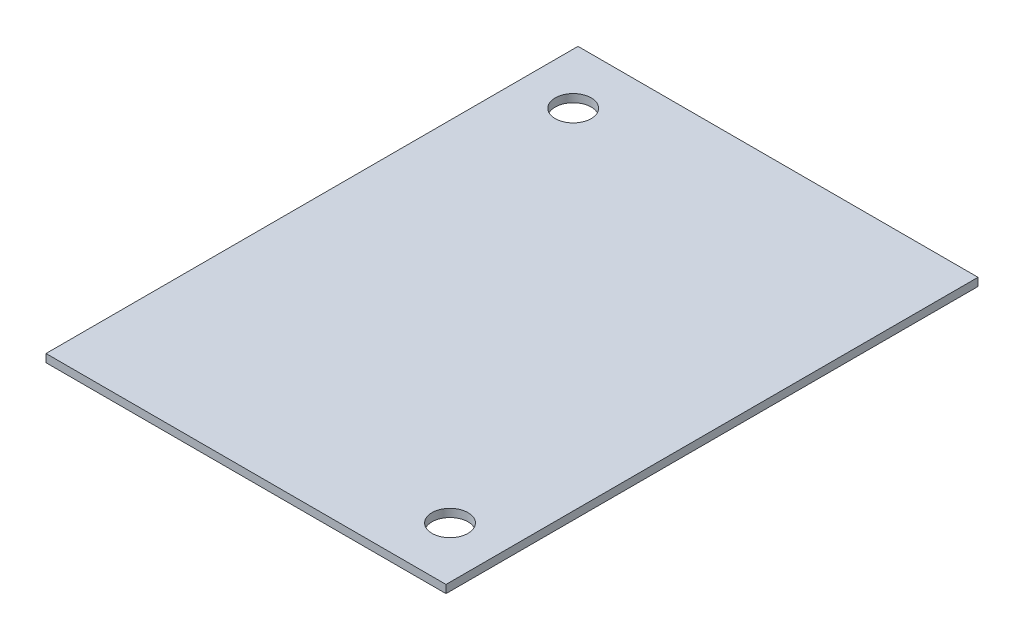
ISO-10303-21;
HEADER;
FILE_DESCRIPTION(('STEP AP214'),'2;1');
FILE_NAME('part.step','',(''),(''),'','','');
FILE_SCHEMA(('AUTOMOTIVE_DESIGN { 1 0 10303 214 1 1 1 1 }'));
ENDSEC;
DATA;
#1=APPLICATION_CONTEXT('core data for automotive mechanical design processes');
#2=APPLICATION_PROTOCOL_DEFINITION('international standard','automotive_design',2000,#1);
#3=PRODUCT_CONTEXT('',#1,'mechanical');
#4=PRODUCT('Part','Part','',(#3));
#5=PRODUCT_RELATED_PRODUCT_CATEGORY('part','',(#4));
#6=PRODUCT_DEFINITION_FORMATION('','',#4);
#7=PRODUCT_DEFINITION_CONTEXT('part definition',#1,'design');
#8=PRODUCT_DEFINITION('design','',#6,#7);
#9=PRODUCT_DEFINITION_SHAPE('','',#8);
#10=(LENGTH_UNIT() NAMED_UNIT(*) SI_UNIT(.MILLI.,.METRE.));
#11=(NAMED_UNIT(*) PLANE_ANGLE_UNIT() SI_UNIT($,.RADIAN.));
#12=(NAMED_UNIT(*) SI_UNIT($,.STERADIAN.) SOLID_ANGLE_UNIT());
#13=UNCERTAINTY_MEASURE_WITH_UNIT(LENGTH_MEASURE(1.E-05),#10,'distance_accuracy_value','');
#14=(GEOMETRIC_REPRESENTATION_CONTEXT(3) GLOBAL_UNCERTAINTY_ASSIGNED_CONTEXT((#13)) GLOBAL_UNIT_ASSIGNED_CONTEXT((#10,
#11,#12)) REPRESENTATION_CONTEXT('',''));
#15=CARTESIAN_POINT('',(0.,0.,0.));
#16=DIRECTION('',(0.,0.,1.));
#17=DIRECTION('',(1.,0.,0.));
#18=AXIS2_PLACEMENT_3D('',#15,#16,#17);
#19=CARTESIAN_POINT('',(0.,1.,0.));
#20=DIRECTION('',(0.,1.,0.));
#21=DIRECTION('',(0.,0.,1.));
#22=AXIS2_PLACEMENT_3D('',#19,#20,#21);
#23=PLANE('',#22);
#24=CARTESIAN_POINT('',(-18.6,1.,-26.25));
#25=DIRECTION('',(0.,1.,0.));
#26=DIRECTION('',(0.,0.,1.));
#27=AXIS2_PLACEMENT_3D('',#24,#25,#26);
#28=CIRCLE('',#27,2.25);
#29=CARTESIAN_POINT('',(-18.6,1.,-24.));
#30=VERTEX_POINT('',#29);
#31=EDGE_CURVE('E107',#30,#30,#28,.T.);
#32=ORIENTED_EDGE('',*,*,#31,.F.);
#33=EDGE_LOOP('',(#32));
#34=FACE_BOUND('',#33,.T.);
#35=DIRECTION('',(0.,0.,-1.));
#36=VECTOR('',#35,1.);
#37=CARTESIAN_POINT('',(25.,1.,-33.25));
#38=LINE('',#37,#36);
#39=CARTESIAN_POINT('',(25.,1.,33.25));
#40=VERTEX_POINT('',#39);
#41=CARTESIAN_POINT('',(25.,1.,-33.25));
#42=VERTEX_POINT('',#41);
#43=EDGE_CURVE('E92',#40,#42,#38,.T.);
#44=ORIENTED_EDGE('',*,*,#43,.T.);
#45=DIRECTION('',(-1.,0.,0.));
#46=VECTOR('',#45,1.);
#47=CARTESIAN_POINT('',(-25.,1.,-33.25));
#48=LINE('',#47,#46);
#49=CARTESIAN_POINT('',(-25.,1.,-33.25));
#50=VERTEX_POINT('',#49);
#51=EDGE_CURVE('E87',#42,#50,#48,.T.);
#52=ORIENTED_EDGE('',*,*,#51,.T.);
#53=DIRECTION('',(0.,0.,1.));
#54=VECTOR('',#53,1.);
#55=CARTESIAN_POINT('',(-25.,1.,-33.25));
#56=LINE('',#55,#54);
#57=CARTESIAN_POINT('',(-25.,1.,33.25));
#58=VERTEX_POINT('',#57);
#59=EDGE_CURVE('E90',#50,#58,#56,.T.);
#60=ORIENTED_EDGE('',*,*,#59,.T.);
#61=DIRECTION('',(1.,0.,0.));
#62=VECTOR('',#61,1.);
#63=CARTESIAN_POINT('',(-25.,1.,33.25));
#64=LINE('',#63,#62);
#65=EDGE_CURVE('E57',#58,#40,#64,.T.);
#66=ORIENTED_EDGE('',*,*,#65,.T.);
#67=EDGE_LOOP('',(#44,#52,#60,#66));
#68=FACE_BOUND('',#67,.T.);
#69=CARTESIAN_POINT('',(18.6,1.,26.35));
#70=DIRECTION('',(0.,1.,0.));
#71=DIRECTION('',(0.,0.,1.));
#72=AXIS2_PLACEMENT_3D('',#69,#70,#71);
#73=CIRCLE('',#72,2.25);
#74=CARTESIAN_POINT('',(18.6,1.,28.6));
#75=VERTEX_POINT('',#74);
#76=EDGE_CURVE('E122',#75,#75,#73,.T.);
#77=ORIENTED_EDGE('',*,*,#76,.F.);
#78=EDGE_LOOP('',(#77));
#79=FACE_BOUND('',#78,.T.);
#80=ADVANCED_FACE('F40',(#34,#68,#79),#23,.T.);
#81=CARTESIAN_POINT('',(0.,0.,0.));
#82=DIRECTION('',(0.,1.,0.));
#83=DIRECTION('',(0.,0.,1.));
#84=AXIS2_PLACEMENT_3D('',#81,#82,#83);
#85=PLANE('',#84);
#86=DIRECTION('',(0.,0.,-1.));
#87=VECTOR('',#86,1.);
#88=CARTESIAN_POINT('',(25.,0.,-33.25));
#89=LINE('',#88,#87);
#90=CARTESIAN_POINT('',(25.,0.,33.25));
#91=VERTEX_POINT('',#90);
#92=CARTESIAN_POINT('',(25.,0.,-33.25));
#93=VERTEX_POINT('',#92);
#94=EDGE_CURVE('E104',#91,#93,#89,.T.);
#95=ORIENTED_EDGE('',*,*,#94,.F.);
#96=DIRECTION('',(1.,0.,0.));
#97=VECTOR('',#96,1.);
#98=CARTESIAN_POINT('',(-25.,0.,33.25));
#99=LINE('',#98,#97);
#100=CARTESIAN_POINT('',(-25.,0.,33.25));
#101=VERTEX_POINT('',#100);
#102=EDGE_CURVE('E80',#101,#91,#99,.T.);
#103=ORIENTED_EDGE('',*,*,#102,.F.);
#104=DIRECTION('',(0.,0.,1.));
#105=VECTOR('',#104,1.);
#106=CARTESIAN_POINT('',(-25.,0.,-33.25));
#107=LINE('',#106,#105);
#108=CARTESIAN_POINT('',(-25.,0.,-33.25));
#109=VERTEX_POINT('',#108);
#110=EDGE_CURVE('E74',#109,#101,#107,.T.);
#111=ORIENTED_EDGE('',*,*,#110,.F.);
#112=DIRECTION('',(-1.,0.,0.));
#113=VECTOR('',#112,1.);
#114=CARTESIAN_POINT('',(-25.,0.,-33.25));
#115=LINE('',#114,#113);
#116=EDGE_CURVE('E96',#93,#109,#115,.T.);
#117=ORIENTED_EDGE('',*,*,#116,.F.);
#118=EDGE_LOOP('',(#95,#103,#111,#117));
#119=FACE_BOUND('',#118,.T.);
#120=CARTESIAN_POINT('',(-18.6,0.,-26.25));
#121=DIRECTION('',(0.,1.,0.));
#122=DIRECTION('',(0.,0.,1.));
#123=AXIS2_PLACEMENT_3D('',#120,#121,#122);
#124=CIRCLE('',#123,2.25);
#125=CARTESIAN_POINT('',(-18.6,0.,-24.));
#126=VERTEX_POINT('',#125);
#127=EDGE_CURVE('E119',#126,#126,#124,.T.);
#128=ORIENTED_EDGE('',*,*,#127,.T.);
#129=EDGE_LOOP('',(#128));
#130=FACE_BOUND('',#129,.T.);
#131=CARTESIAN_POINT('',(18.6,0.,26.35));
#132=DIRECTION('',(0.,1.,0.));
#133=DIRECTION('',(0.,0.,1.));
#134=AXIS2_PLACEMENT_3D('',#131,#132,#133);
#135=CIRCLE('',#134,2.25);
#136=CARTESIAN_POINT('',(18.6,0.,28.6));
#137=VERTEX_POINT('',#136);
#138=EDGE_CURVE('E125',#137,#137,#135,.T.);
#139=ORIENTED_EDGE('',*,*,#138,.T.);
#140=EDGE_LOOP('',(#139));
#141=FACE_BOUND('',#140,.T.);
#142=ADVANCED_FACE('F115',(#119,#130,#141),#85,.F.);
#143=CARTESIAN_POINT('',(25.,1.,-33.25));
#144=DIRECTION('',(-1.,0.,0.));
#145=DIRECTION('',(0.,0.,1.));
#146=AXIS2_PLACEMENT_3D('',#143,#144,#145);
#147=PLANE('',#146);
#148=ORIENTED_EDGE('',*,*,#94,.T.);
#149=DIRECTION('',(0.,-1.,0.));
#150=VECTOR('',#149,1.);
#151=CARTESIAN_POINT('',(25.,1.,-33.25));
#152=LINE('',#151,#150);
#153=EDGE_CURVE('E11',#42,#93,#152,.T.);
#154=ORIENTED_EDGE('',*,*,#153,.F.);
#155=ORIENTED_EDGE('',*,*,#43,.F.);
#156=DIRECTION('',(0.,-1.,0.));
#157=VECTOR('',#156,1.);
#158=CARTESIAN_POINT('',(25.,1.,33.25));
#159=LINE('',#158,#157);
#160=EDGE_CURVE('E100',#40,#91,#159,.T.);
#161=ORIENTED_EDGE('',*,*,#160,.T.);
#162=EDGE_LOOP('',(#148,#154,#155,#161));
#163=FACE_BOUND('',#162,.T.);
#164=ADVANCED_FACE('F42',(#163),#147,.F.);
#165=CARTESIAN_POINT('',(-25.,1.,-33.25));
#166=DIRECTION('',(0.,0.,1.));
#167=DIRECTION('',(1.,0.,0.));
#168=AXIS2_PLACEMENT_3D('',#165,#166,#167);
#169=PLANE('',#168);
#170=ORIENTED_EDGE('',*,*,#116,.T.);
#171=DIRECTION('',(0.,-1.,0.));
#172=VECTOR('',#171,1.);
#173=CARTESIAN_POINT('',(-25.,1.,-33.25));
#174=LINE('',#173,#172);
#175=EDGE_CURVE('E49',#50,#109,#174,.T.);
#176=ORIENTED_EDGE('',*,*,#175,.F.);
#177=ORIENTED_EDGE('',*,*,#51,.F.);
#178=ORIENTED_EDGE('',*,*,#153,.T.);
#179=EDGE_LOOP('',(#170,#176,#177,#178));
#180=FACE_BOUND('',#179,.T.);
#181=ADVANCED_FACE('F95',(#180),#169,.F.);
#182=CARTESIAN_POINT('',(-25.,1.,-33.25));
#183=DIRECTION('',(1.,0.,0.));
#184=DIRECTION('',(0.,0.,-1.));
#185=AXIS2_PLACEMENT_3D('',#182,#183,#184);
#186=PLANE('',#185);
#187=ORIENTED_EDGE('',*,*,#110,.T.);
#188=DIRECTION('',(0.,-1.,0.));
#189=VECTOR('',#188,1.);
#190=CARTESIAN_POINT('',(-25.,1.,33.25));
#191=LINE('',#190,#189);
#192=EDGE_CURVE('E97',#58,#101,#191,.T.);
#193=ORIENTED_EDGE('',*,*,#192,.F.);
#194=ORIENTED_EDGE('',*,*,#59,.F.);
#195=ORIENTED_EDGE('',*,*,#175,.T.);
#196=EDGE_LOOP('',(#187,#193,#194,#195));
#197=FACE_BOUND('',#196,.T.);
#198=ADVANCED_FACE('F98',(#197),#186,.F.);
#199=CARTESIAN_POINT('',(-25.,1.,33.25));
#200=DIRECTION('',(0.,0.,-1.));
#201=DIRECTION('',(-1.,0.,0.));
#202=AXIS2_PLACEMENT_3D('',#199,#200,#201);
#203=PLANE('',#202);
#204=ORIENTED_EDGE('',*,*,#102,.T.);
#205=ORIENTED_EDGE('',*,*,#160,.F.);
#206=ORIENTED_EDGE('',*,*,#65,.F.);
#207=ORIENTED_EDGE('',*,*,#192,.T.);
#208=EDGE_LOOP('',(#204,#205,#206,#207));
#209=FACE_BOUND('',#208,.T.);
#210=ADVANCED_FACE('F112',(#209),#203,.F.);
#211=CARTESIAN_POINT('',(-18.6,1.,-26.25));
#212=DIRECTION('',(0.,-1.,0.));
#213=DIRECTION('',(0.,0.,-1.));
#214=AXIS2_PLACEMENT_3D('',#211,#212,#213);
#215=CYLINDRICAL_SURFACE('',#214,2.25);
#216=ORIENTED_EDGE('',*,*,#31,.T.);
#217=EDGE_LOOP('',(#216));
#218=FACE_BOUND('',#217,.T.);
#219=ORIENTED_EDGE('',*,*,#127,.F.);
#220=EDGE_LOOP('',(#219));
#221=FACE_BOUND('',#220,.T.);
#222=ADVANCED_FACE('F142',(#218,#221),#215,.F.);
#223=CARTESIAN_POINT('',(18.6,1.,26.35));
#224=DIRECTION('',(0.,-1.,0.));
#225=DIRECTION('',(0.,0.,-1.));
#226=AXIS2_PLACEMENT_3D('',#223,#224,#225);
#227=CYLINDRICAL_SURFACE('',#226,2.25);
#228=ORIENTED_EDGE('',*,*,#76,.T.);
#229=EDGE_LOOP('',(#228));
#230=FACE_BOUND('',#229,.T.);
#231=ORIENTED_EDGE('',*,*,#138,.F.);
#232=EDGE_LOOP('',(#231));
#233=FACE_BOUND('',#232,.T.);
#234=ADVANCED_FACE('F131',(#230,#233),#227,.F.);
#235=CLOSED_SHELL('',(#80,#142,#164,#181,#198,#210,#222,#234));
#236=MANIFOLD_SOLID_BREP('B2',#235);
#237=ADVANCED_BREP_SHAPE_REPRESENTATION('',(#18,#236),#14);
#238=SHAPE_DEFINITION_REPRESENTATION(#9,#237);
ENDSEC;
END-ISO-10303-21;
